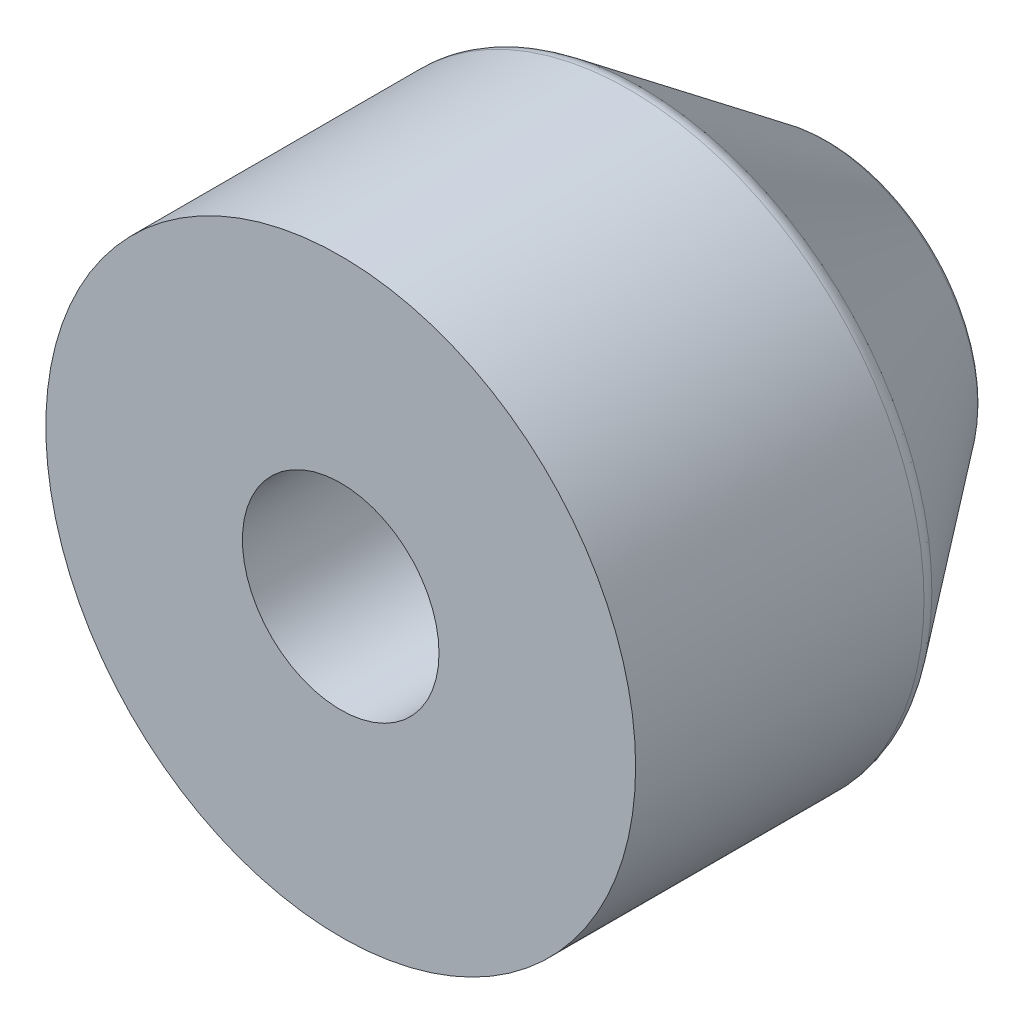
ISO-10303-21;
HEADER;
FILE_DESCRIPTION(('STEP AP214'),'2;1');
FILE_NAME('part.step','',(''),(''),'','','');
FILE_SCHEMA(('AUTOMOTIVE_DESIGN { 1 0 10303 214 1 1 1 1 }'));
ENDSEC;
DATA;
#1=APPLICATION_CONTEXT('core data for automotive mechanical design processes');
#2=APPLICATION_PROTOCOL_DEFINITION('international standard','automotive_design',2000,#1);
#3=PRODUCT_CONTEXT('',#1,'mechanical');
#4=PRODUCT('Part','Part','',(#3));
#5=PRODUCT_RELATED_PRODUCT_CATEGORY('part','',(#4));
#6=PRODUCT_DEFINITION_FORMATION('','',#4);
#7=PRODUCT_DEFINITION_CONTEXT('part definition',#1,'design');
#8=PRODUCT_DEFINITION('design','',#6,#7);
#9=PRODUCT_DEFINITION_SHAPE('','',#8);
#10=(LENGTH_UNIT() NAMED_UNIT(*) SI_UNIT(.MILLI.,.METRE.));
#11=(NAMED_UNIT(*) PLANE_ANGLE_UNIT() SI_UNIT($,.RADIAN.));
#12=(NAMED_UNIT(*) SI_UNIT($,.STERADIAN.) SOLID_ANGLE_UNIT());
#13=UNCERTAINTY_MEASURE_WITH_UNIT(LENGTH_MEASURE(1.E-05),#10,'distance_accuracy_value','');
#14=(GEOMETRIC_REPRESENTATION_CONTEXT(3) GLOBAL_UNCERTAINTY_ASSIGNED_CONTEXT((#13)) GLOBAL_UNIT_ASSIGNED_CONTEXT((#10,
#11,#12)) REPRESENTATION_CONTEXT('',''));
#15=CARTESIAN_POINT('',(0.,0.,0.));
#16=DIRECTION('',(0.,0.,1.));
#17=DIRECTION('',(1.,0.,0.));
#18=AXIS2_PLACEMENT_3D('',#15,#16,#17);
#19=CARTESIAN_POINT('',(7.11199999999999,0.,-25.4));
#20=DIRECTION('',(0.,0.,-1.));
#21=DIRECTION('',(-1.,0.,0.));
#22=AXIS2_PLACEMENT_3D('',#19,#20,#21);
#23=PLANE('',#22);
#24=CARTESIAN_POINT('',(0.,0.,-25.4));
#25=DIRECTION('',(0.,0.,1.));
#26=DIRECTION('',(1.,0.,0.));
#27=AXIS2_PLACEMENT_3D('',#24,#25,#26);
#28=CIRCLE('',#27,5.08);
#29=CARTESIAN_POINT('',(5.08,0.,-25.4));
#30=VERTEX_POINT('',#29);
#31=EDGE_CURVE('E10',#30,#30,#28,.T.);
#32=ORIENTED_EDGE('',*,*,#31,.T.);
#33=EDGE_LOOP('',(#32));
#34=FACE_BOUND('',#33,.T.);
#35=CARTESIAN_POINT('',(0.,0.,-25.4));
#36=DIRECTION('',(0.,0.,1.));
#37=DIRECTION('',(1.,0.,0.));
#38=AXIS2_PLACEMENT_3D('',#35,#36,#37);
#39=CIRCLE('',#38,7.11199999999999);
#40=CARTESIAN_POINT('',(7.11199999999999,0.,-25.4));
#41=VERTEX_POINT('',#40);
#42=EDGE_CURVE('E60',#41,#41,#39,.T.);
#43=ORIENTED_EDGE('',*,*,#42,.F.);
#44=EDGE_LOOP('',(#43));
#45=FACE_BOUND('',#44,.T.);
#46=ADVANCED_FACE('F35',(#34,#45),#23,.T.);
#47=CARTESIAN_POINT('',(0.,0.,0.));
#48=DIRECTION('',(0.,0.,1.));
#49=DIRECTION('',(1.,0.,0.));
#50=AXIS2_PLACEMENT_3D('',#47,#48,#49);
#51=CYLINDRICAL_SURFACE('',#50,5.08);
#52=CARTESIAN_POINT('',(0.,0.,0.));
#53=DIRECTION('',(0.,0.,1.));
#54=DIRECTION('',(1.,0.,0.));
#55=AXIS2_PLACEMENT_3D('',#52,#53,#54);
#56=CIRCLE('',#55,5.08);
#57=CARTESIAN_POINT('',(5.08,0.,0.));
#58=VERTEX_POINT('',#57);
#59=EDGE_CURVE('E41',#58,#58,#56,.T.);
#60=ORIENTED_EDGE('',*,*,#59,.T.);
#61=EDGE_LOOP('',(#60));
#62=FACE_BOUND('',#61,.T.);
#63=ORIENTED_EDGE('',*,*,#31,.F.);
#64=EDGE_LOOP('',(#63));
#65=FACE_BOUND('',#64,.T.);
#66=ADVANCED_FACE('F68',(#62,#65),#51,.F.);
#67=CARTESIAN_POINT('',(5.08,0.,0.));
#68=DIRECTION('',(0.,0.,1.));
#69=DIRECTION('',(1.,0.,0.));
#70=AXIS2_PLACEMENT_3D('',#67,#68,#69);
#71=PLANE('',#70);
#72=CARTESIAN_POINT('',(0.,0.,0.));
#73=DIRECTION('',(0.,0.,1.));
#74=DIRECTION('',(1.,0.,0.));
#75=AXIS2_PLACEMENT_3D('',#72,#73,#74);
#76=CIRCLE('',#75,15.24);
#77=CARTESIAN_POINT('',(15.24,0.,0.));
#78=VERTEX_POINT('',#77);
#79=EDGE_CURVE('E45',#78,#78,#76,.T.);
#80=ORIENTED_EDGE('',*,*,#79,.T.);
#81=EDGE_LOOP('',(#80));
#82=FACE_BOUND('',#81,.T.);
#83=ORIENTED_EDGE('',*,*,#59,.F.);
#84=EDGE_LOOP('',(#83));
#85=FACE_BOUND('',#84,.T.);
#86=ADVANCED_FACE('F72',(#82,#85),#71,.T.);
#87=CARTESIAN_POINT('',(0.,0.,0.));
#88=DIRECTION('',(0.,0.,1.));
#89=DIRECTION('',(1.,0.,0.));
#90=AXIS2_PLACEMENT_3D('',#87,#88,#89);
#91=CYLINDRICAL_SURFACE('',#90,15.24);
#92=CARTESIAN_POINT('',(0.,0.,-14.9013333333333));
#93=DIRECTION('',(0.,0.,1.));
#94=DIRECTION('',(1.,0.,0.));
#95=AXIS2_PLACEMENT_3D('',#92,#93,#94);
#96=CIRCLE('',#95,15.24);
#97=CARTESIAN_POINT('',(15.24,0.,-14.9013333333333));
#98=VERTEX_POINT('',#97);
#99=EDGE_CURVE('E49',#98,#98,#96,.T.);
#100=ORIENTED_EDGE('',*,*,#99,.T.);
#101=EDGE_LOOP('',(#100));
#102=FACE_BOUND('',#101,.T.);
#103=ORIENTED_EDGE('',*,*,#79,.F.);
#104=EDGE_LOOP('',(#103));
#105=FACE_BOUND('',#104,.T.);
#106=ADVANCED_FACE('F76',(#102,#105),#91,.T.);
#107=CARTESIAN_POINT('',(0.,0.,-14.9013333333333));
#108=DIRECTION('',(0.,0.,1.));
#109=DIRECTION('',(1.,0.,0.));
#110=AXIS2_PLACEMENT_3D('',#107,#108,#109);
#111=TOROIDAL_SURFACE('',#110,14.224,1.016);
#112=CARTESIAN_POINT('',(0.,0.,-15.5109333333333));
#113=DIRECTION('',(0.,0.,1.));
#114=DIRECTION('',(1.,0.,0.));
#115=AXIS2_PLACEMENT_3D('',#112,#113,#114);
#116=CIRCLE('',#115,15.0368);
#117=CARTESIAN_POINT('',(15.0368,0.,-15.5109333333333));
#118=VERTEX_POINT('',#117);
#119=EDGE_CURVE('E54',#118,#118,#116,.T.);
#120=ORIENTED_EDGE('',*,*,#119,.T.);
#121=EDGE_LOOP('',(#120));
#122=FACE_BOUND('',#121,.T.);
#123=ORIENTED_EDGE('',*,*,#99,.F.);
#124=EDGE_LOOP('',(#123));
#125=FACE_BOUND('',#124,.T.);
#126=ADVANCED_FACE('F83',(#122,#125),#111,.T.);
#127=CARTESIAN_POINT('',(0.,0.,-15.5109333333333));
#128=DIRECTION('',(0.,0.,1.));
#129=DIRECTION('',(1.,0.,0.));
#130=AXIS2_PLACEMENT_3D('',#127,#128,#129);
#131=CONICAL_SURFACE('',#130,15.0368,0.643501108793284);
#132=CARTESIAN_POINT('',(0.,0.,-24.9936));
#133=DIRECTION('',(0.,0.,1.));
#134=DIRECTION('',(1.,0.,0.));
#135=AXIS2_PLACEMENT_3D('',#132,#133,#134);
#136=CIRCLE('',#135,7.9248);
#137=CARTESIAN_POINT('',(7.9248,0.,-24.9936));
#138=VERTEX_POINT('',#137);
#139=EDGE_CURVE('E57',#138,#138,#136,.T.);
#140=ORIENTED_EDGE('',*,*,#139,.T.);
#141=EDGE_LOOP('',(#140));
#142=FACE_BOUND('',#141,.T.);
#143=ORIENTED_EDGE('',*,*,#119,.F.);
#144=EDGE_LOOP('',(#143));
#145=FACE_BOUND('',#144,.T.);
#146=ADVANCED_FACE('F87',(#142,#145),#131,.T.);
#147=CARTESIAN_POINT('',(0.,0.,-24.384));
#148=DIRECTION('',(0.,0.,1.));
#149=DIRECTION('',(1.,0.,0.));
#150=AXIS2_PLACEMENT_3D('',#147,#148,#149);
#151=TOROIDAL_SURFACE('',#150,7.112,1.016);
#152=ORIENTED_EDGE('',*,*,#42,.T.);
#153=EDGE_LOOP('',(#152));
#154=FACE_BOUND('',#153,.T.);
#155=ORIENTED_EDGE('',*,*,#139,.F.);
#156=EDGE_LOOP('',(#155));
#157=FACE_BOUND('',#156,.T.);
#158=ADVANCED_FACE('F64',(#154,#157),#151,.T.);
#159=CLOSED_SHELL('',(#46,#66,#86,#106,#126,#146,#158));
#160=MANIFOLD_SOLID_BREP('B2',#159);
#161=ADVANCED_BREP_SHAPE_REPRESENTATION('',(#18,#160),#14);
#162=SHAPE_DEFINITION_REPRESENTATION(#9,#161);
ENDSEC;
END-ISO-10303-21;
